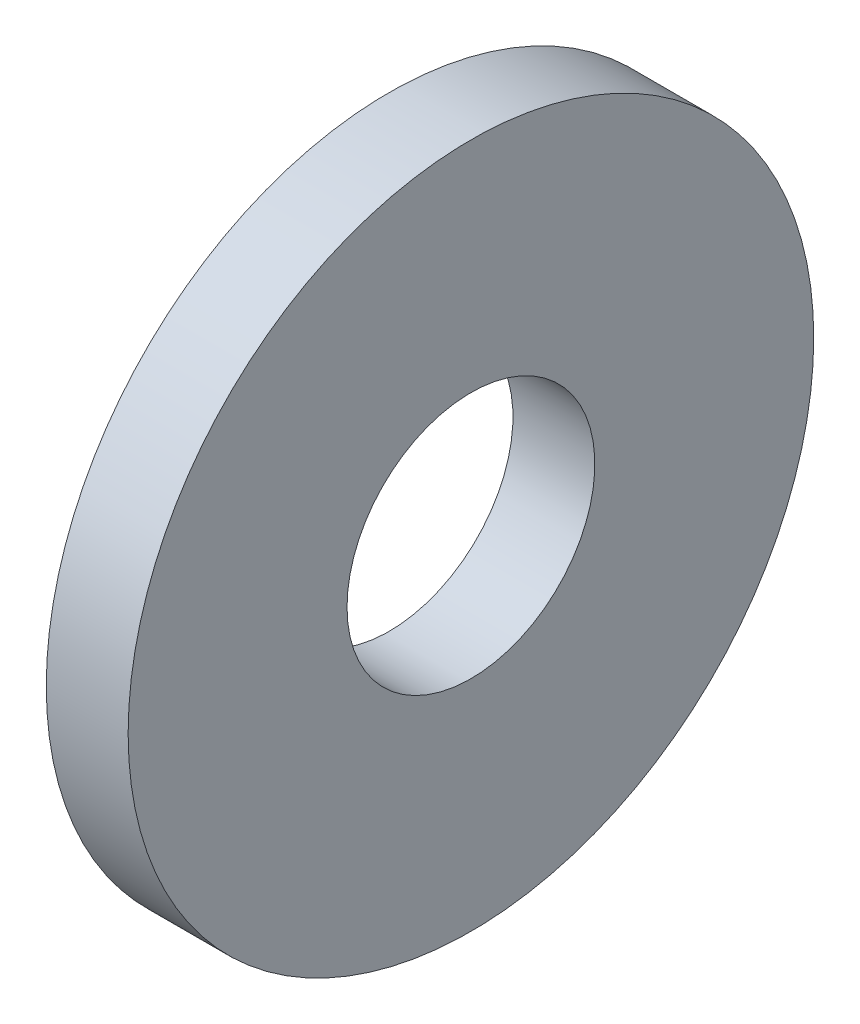
ISO-10303-21;
HEADER;
FILE_DESCRIPTION(('STEP AP214'),'2;1');
FILE_NAME('part.step','',(''),(''),'','','');
FILE_SCHEMA(('AUTOMOTIVE_DESIGN { 1 0 10303 214 1 1 1 1 }'));
ENDSEC;
DATA;
#1=APPLICATION_CONTEXT('core data for automotive mechanical design processes');
#2=APPLICATION_PROTOCOL_DEFINITION('international standard','automotive_design',2000,#1);
#3=PRODUCT_CONTEXT('',#1,'mechanical');
#4=PRODUCT('Part','Part','',(#3));
#5=PRODUCT_RELATED_PRODUCT_CATEGORY('part','',(#4));
#6=PRODUCT_DEFINITION_FORMATION('','',#4);
#7=PRODUCT_DEFINITION_CONTEXT('part definition',#1,'design');
#8=PRODUCT_DEFINITION('design','',#6,#7);
#9=PRODUCT_DEFINITION_SHAPE('','',#8);
#10=(LENGTH_UNIT() NAMED_UNIT(*) SI_UNIT(.MILLI.,.METRE.));
#11=(NAMED_UNIT(*) PLANE_ANGLE_UNIT() SI_UNIT($,.RADIAN.));
#12=(NAMED_UNIT(*) SI_UNIT($,.STERADIAN.) SOLID_ANGLE_UNIT());
#13=UNCERTAINTY_MEASURE_WITH_UNIT(LENGTH_MEASURE(1.E-05),#10,'distance_accuracy_value','');
#14=(GEOMETRIC_REPRESENTATION_CONTEXT(3) GLOBAL_UNCERTAINTY_ASSIGNED_CONTEXT((#13)) GLOBAL_UNIT_ASSIGNED_CONTEXT((#10,
#11,#12)) REPRESENTATION_CONTEXT('',''));
#15=CARTESIAN_POINT('',(0.,0.,0.));
#16=DIRECTION('',(0.,0.,1.));
#17=DIRECTION('',(1.,0.,0.));
#18=AXIS2_PLACEMENT_3D('',#15,#16,#17);
#19=CARTESIAN_POINT('',(0.,2.8829,0.));
#20=DIRECTION('',(-1.,0.,0.));
#21=DIRECTION('',(0.,0.,1.));
#22=AXIS2_PLACEMENT_3D('',#19,#20,#21);
#23=PLANE('',#22);
#24=CARTESIAN_POINT('',(0.,0.,0.));
#25=DIRECTION('',(-1.,0.,0.));
#26=DIRECTION('',(0.,0.,1.));
#27=AXIS2_PLACEMENT_3D('',#24,#25,#26);
#28=CIRCLE('',#27,2.8829);
#29=CARTESIAN_POINT('',(0.,0.,2.8829));
#30=VERTEX_POINT('',#29);
#31=EDGE_CURVE('E18',#30,#30,#28,.T.);
#32=ORIENTED_EDGE('',*,*,#31,.T.);
#33=EDGE_LOOP('',(#32));
#34=FACE_BOUND('',#33,.T.);
#35=CARTESIAN_POINT('',(0.,0.,0.));
#36=DIRECTION('',(-1.,0.,0.));
#37=DIRECTION('',(0.,0.,1.));
#38=AXIS2_PLACEMENT_3D('',#35,#36,#37);
#39=CIRCLE('',#38,7.9756);
#40=CARTESIAN_POINT('',(0.,0.,7.9756));
#41=VERTEX_POINT('',#40);
#42=EDGE_CURVE('E27',#41,#41,#39,.T.);
#43=ORIENTED_EDGE('',*,*,#42,.F.);
#44=EDGE_LOOP('',(#43));
#45=FACE_BOUND('',#44,.T.);
#46=ADVANCED_FACE('F15',(#34,#45),#23,.F.);
#47=CARTESIAN_POINT('',(-34.9249999999999,0.,0.));
#48=DIRECTION('',(-1.,0.,0.));
#49=DIRECTION('',(0.,0.,1.));
#50=AXIS2_PLACEMENT_3D('',#47,#48,#49);
#51=CYLINDRICAL_SURFACE('',#50,2.8829);
#52=ORIENTED_EDGE('',*,*,#31,.F.);
#53=EDGE_LOOP('',(#52));
#54=FACE_BOUND('',#53,.T.);
#55=CARTESIAN_POINT('',(-1.905,0.,0.));
#56=DIRECTION('',(-1.,0.,0.));
#57=DIRECTION('',(0.,0.,1.));
#58=AXIS2_PLACEMENT_3D('',#55,#56,#57);
#59=CIRCLE('',#58,2.8829);
#60=CARTESIAN_POINT('',(-1.905,0.,2.8829));
#61=VERTEX_POINT('',#60);
#62=EDGE_CURVE('E22',#61,#61,#59,.T.);
#63=ORIENTED_EDGE('',*,*,#62,.T.);
#64=EDGE_LOOP('',(#63));
#65=FACE_BOUND('',#64,.T.);
#66=ADVANCED_FACE('F37',(#54,#65),#51,.F.);
#67=CARTESIAN_POINT('',(-34.9249999999999,0.,0.));
#68=DIRECTION('',(-1.,0.,0.));
#69=DIRECTION('',(0.,0.,1.));
#70=AXIS2_PLACEMENT_3D('',#67,#68,#69);
#71=CYLINDRICAL_SURFACE('',#70,7.9756);
#72=CARTESIAN_POINT('',(-1.905,0.,0.));
#73=DIRECTION('',(-1.,0.,0.));
#74=DIRECTION('',(0.,0.,1.));
#75=AXIS2_PLACEMENT_3D('',#72,#73,#74);
#76=CIRCLE('',#75,7.9756);
#77=CARTESIAN_POINT('',(-1.905,0.,7.9756));
#78=VERTEX_POINT('',#77);
#79=EDGE_CURVE('E10',#78,#78,#76,.F.);
#80=ORIENTED_EDGE('',*,*,#79,.T.);
#81=EDGE_LOOP('',(#80));
#82=FACE_BOUND('',#81,.T.);
#83=ORIENTED_EDGE('',*,*,#42,.T.);
#84=EDGE_LOOP('',(#83));
#85=FACE_BOUND('',#84,.T.);
#86=ADVANCED_FACE('F40',(#82,#85),#71,.T.);
#87=CARTESIAN_POINT('',(-1.905,7.9756,0.));
#88=DIRECTION('',(1.,0.,0.));
#89=DIRECTION('',(0.,0.,-1.));
#90=AXIS2_PLACEMENT_3D('',#87,#88,#89);
#91=PLANE('',#90);
#92=ORIENTED_EDGE('',*,*,#79,.F.);
#93=EDGE_LOOP('',(#92));
#94=FACE_BOUND('',#93,.T.);
#95=ORIENTED_EDGE('',*,*,#62,.F.);
#96=EDGE_LOOP('',(#95));
#97=FACE_BOUND('',#96,.T.);
#98=ADVANCED_FACE('F43',(#94,#97),#91,.F.);
#99=CLOSED_SHELL('',(#46,#66,#86,#98));
#100=MANIFOLD_SOLID_BREP('B1',#99);
#101=ADVANCED_BREP_SHAPE_REPRESENTATION('',(#18,#100),#14);
#102=SHAPE_DEFINITION_REPRESENTATION(#9,#101);
ENDSEC;
END-ISO-10303-21;
